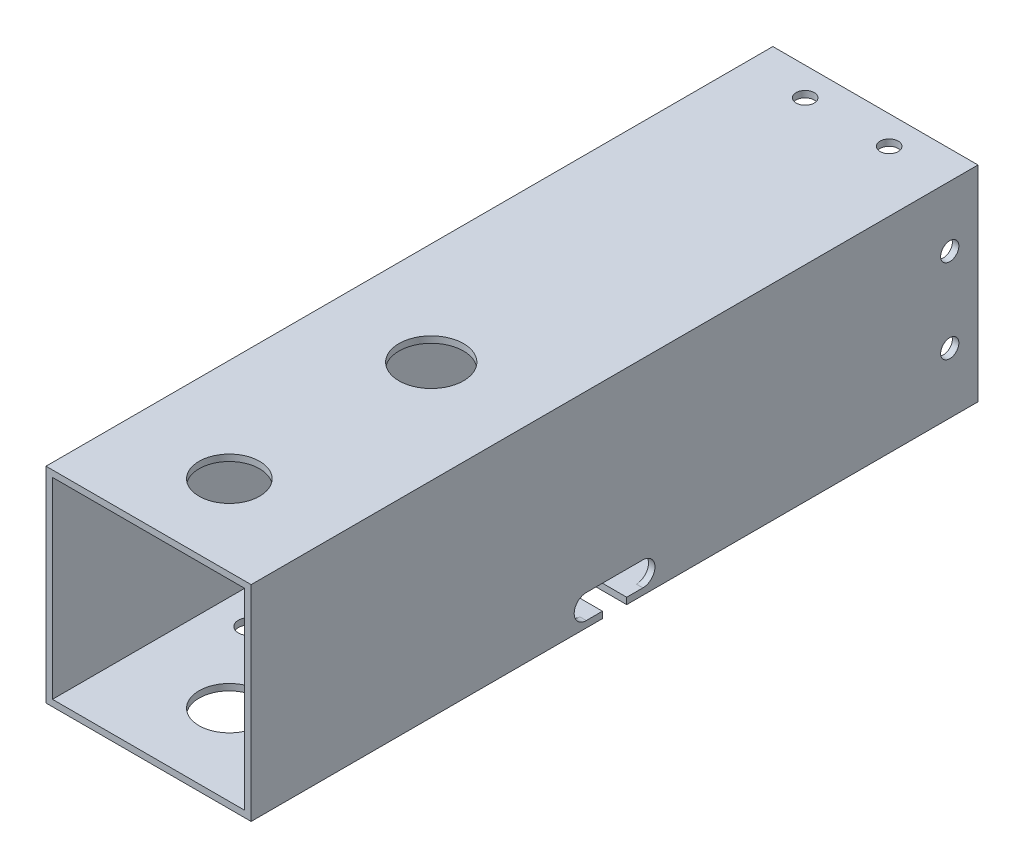
ISO-10303-21;
HEADER;
FILE_DESCRIPTION(('STEP AP214'),'2;1');
FILE_NAME('part.step','',(''),(''),'','','');
FILE_SCHEMA(('AUTOMOTIVE_DESIGN { 1 0 10303 214 1 1 1 1 }'));
ENDSEC;
DATA;
#1=APPLICATION_CONTEXT('core data for automotive mechanical design processes');
#2=APPLICATION_PROTOCOL_DEFINITION('international standard','automotive_design',2000,#1);
#3=PRODUCT_CONTEXT('',#1,'mechanical');
#4=PRODUCT('Part','Part','',(#3));
#5=PRODUCT_RELATED_PRODUCT_CATEGORY('part','',(#4));
#6=PRODUCT_DEFINITION_FORMATION('','',#4);
#7=PRODUCT_DEFINITION_CONTEXT('part definition',#1,'design');
#8=PRODUCT_DEFINITION('design','',#6,#7);
#9=PRODUCT_DEFINITION_SHAPE('','',#8);
#10=(LENGTH_UNIT() NAMED_UNIT(*) SI_UNIT(.MILLI.,.METRE.));
#11=(NAMED_UNIT(*) PLANE_ANGLE_UNIT() SI_UNIT($,.RADIAN.));
#12=(NAMED_UNIT(*) SI_UNIT($,.STERADIAN.) SOLID_ANGLE_UNIT());
#13=UNCERTAINTY_MEASURE_WITH_UNIT(LENGTH_MEASURE(1.E-05),#10,'distance_accuracy_value','');
#14=(GEOMETRIC_REPRESENTATION_CONTEXT(3) GLOBAL_UNCERTAINTY_ASSIGNED_CONTEXT((#13)) GLOBAL_UNIT_ASSIGNED_CONTEXT((#10,
#11,#12)) REPRESENTATION_CONTEXT('',''));
#15=CARTESIAN_POINT('',(0.,0.,0.));
#16=DIRECTION('',(0.,0.,1.));
#17=DIRECTION('',(1.,0.,0.));
#18=AXIS2_PLACEMENT_3D('',#15,#16,#17);
#19=CARTESIAN_POINT('',(25.4,-25.4,180.));
#20=DIRECTION('',(-1.,0.,0.));
#21=DIRECTION('',(0.,0.,1.));
#22=AXIS2_PLACEMENT_3D('',#19,#20,#21);
#23=PLANE('',#22);
#24=CARTESIAN_POINT('',(25.4,-10.4,7.));
#25=DIRECTION('',(1.,0.,0.));
#26=DIRECTION('',(0.,0.,-1.));
#27=AXIS2_PLACEMENT_3D('',#24,#25,#26);
#28=CIRCLE('',#27,2.25);
#29=CARTESIAN_POINT('',(25.4,-10.4,4.75));
#30=VERTEX_POINT('',#29);
#31=EDGE_CURVE('E241',#30,#30,#28,.T.);
#32=ORIENTED_EDGE('',*,*,#31,.F.);
#33=EDGE_LOOP('',(#32));
#34=FACE_BOUND('',#33,.T.);
#35=CARTESIAN_POINT('',(25.4,-20.8,83.));
#36=DIRECTION('',(1.,0.,0.));
#37=DIRECTION('',(0.,0.,-1.));
#38=AXIS2_PLACEMENT_3D('',#35,#36,#37);
#39=CIRCLE('',#38,3.);
#40=CARTESIAN_POINT('',(25.4,-23.8,83.));
#41=VERTEX_POINT('',#40);
#42=CARTESIAN_POINT('',(25.4,-17.8,83.));
#43=VERTEX_POINT('',#42);
#44=EDGE_CURVE('E428',#41,#43,#39,.T.);
#45=ORIENTED_EDGE('',*,*,#44,.F.);
#46=DIRECTION('',(0.,0.,-1.));
#47=VECTOR('',#46,1.);
#48=CARTESIAN_POINT('',(25.4,-23.8,97.));
#49=LINE('',#48,#47);
#50=CARTESIAN_POINT('',(25.4,-23.8,87.));
#51=VERTEX_POINT('',#50);
#52=EDGE_CURVE('E169',#51,#41,#49,.T.);
#53=ORIENTED_EDGE('',*,*,#52,.F.);
#54=DIRECTION('',(0.,-1.,0.));
#55=VECTOR('',#54,1.);
#56=CARTESIAN_POINT('',(25.4,-4.44644735455528,87.));
#57=LINE('',#56,#55);
#58=CARTESIAN_POINT('',(25.4,-25.4,87.));
#59=VERTEX_POINT('',#58);
#60=EDGE_CURVE('E367',#51,#59,#57,.T.);
#61=ORIENTED_EDGE('',*,*,#60,.T.);
#62=DIRECTION('',(0.,0.,-1.));
#63=VECTOR('',#62,1.);
#64=CARTESIAN_POINT('',(25.4,-25.4,180.));
#65=LINE('',#64,#63);
#66=CARTESIAN_POINT('',(25.4,-25.4,0.));
#67=VERTEX_POINT('',#66);
#68=EDGE_CURVE('E198',#59,#67,#65,.T.);
#69=ORIENTED_EDGE('',*,*,#68,.T.);
#70=DIRECTION('',(0.,1.,0.));
#71=VECTOR('',#70,1.);
#72=CARTESIAN_POINT('',(25.4,-25.4,0.));
#73=LINE('',#72,#71);
#74=CARTESIAN_POINT('',(25.4,25.4,0.));
#75=VERTEX_POINT('',#74);
#76=EDGE_CURVE('E187',#67,#75,#73,.T.);
#77=ORIENTED_EDGE('',*,*,#76,.T.);
#78=DIRECTION('',(0.,0.,-1.));
#79=VECTOR('',#78,1.);
#80=CARTESIAN_POINT('',(25.4,25.4,180.));
#81=LINE('',#80,#79);
#82=CARTESIAN_POINT('',(25.4,25.4,180.));
#83=VERTEX_POINT('',#82);
#84=EDGE_CURVE('E11',#83,#75,#81,.T.);
#85=ORIENTED_EDGE('',*,*,#84,.F.);
#86=DIRECTION('',(0.,1.,0.));
#87=VECTOR('',#86,1.);
#88=CARTESIAN_POINT('',(25.4,-25.4,180.));
#89=LINE('',#88,#87);
#90=CARTESIAN_POINT('',(25.4,-25.4,180.));
#91=VERTEX_POINT('',#90);
#92=EDGE_CURVE('E188',#91,#83,#89,.T.);
#93=ORIENTED_EDGE('',*,*,#92,.F.);
#94=CARTESIAN_POINT('',(25.4,-25.4,93.));
#95=VERTEX_POINT('',#94);
#96=EDGE_CURVE('E207',#91,#95,#65,.T.);
#97=ORIENTED_EDGE('',*,*,#96,.T.);
#98=DIRECTION('',(0.,-1.,0.));
#99=VECTOR('',#98,1.);
#100=CARTESIAN_POINT('',(25.4,-4.44644735455528,93.));
#101=LINE('',#100,#99);
#102=CARTESIAN_POINT('',(25.4,-23.8,93.));
#103=VERTEX_POINT('',#102);
#104=EDGE_CURVE('E375',#103,#95,#101,.T.);
#105=ORIENTED_EDGE('',*,*,#104,.F.);
#106=CARTESIAN_POINT('',(25.4,-23.8,97.));
#107=VERTEX_POINT('',#106);
#108=EDGE_CURVE('E485',#107,#103,#49,.T.);
#109=ORIENTED_EDGE('',*,*,#108,.F.);
#110=CARTESIAN_POINT('',(25.4,-20.8,97.));
#111=DIRECTION('',(1.,0.,0.));
#112=DIRECTION('',(0.,0.,-1.));
#113=AXIS2_PLACEMENT_3D('',#110,#111,#112);
#114=CIRCLE('',#113,3.);
#115=CARTESIAN_POINT('',(25.4,-17.8,97.));
#116=VERTEX_POINT('',#115);
#117=EDGE_CURVE('E356',#116,#107,#114,.T.);
#118=ORIENTED_EDGE('',*,*,#117,.F.);
#119=DIRECTION('',(0.,0.,1.));
#120=VECTOR('',#119,1.);
#121=CARTESIAN_POINT('',(25.4,-17.8,97.));
#122=LINE('',#121,#120);
#123=EDGE_CURVE('E170',#43,#116,#122,.T.);
#124=ORIENTED_EDGE('',*,*,#123,.F.);
#125=EDGE_LOOP('',(#45,#53,#61,#69,#77,#85,#93,#97,#105,#109,#118,#124));
#126=FACE_BOUND('',#125,.T.);
#127=CARTESIAN_POINT('',(25.4,10.4,7.));
#128=DIRECTION('',(1.,0.,0.));
#129=DIRECTION('',(0.,0.,-1.));
#130=AXIS2_PLACEMENT_3D('',#127,#128,#129);
#131=CIRCLE('',#130,2.25);
#132=CARTESIAN_POINT('',(25.4,10.4,4.75));
#133=VERTEX_POINT('',#132);
#134=EDGE_CURVE('E242',#133,#133,#131,.T.);
#135=ORIENTED_EDGE('',*,*,#134,.F.);
#136=EDGE_LOOP('',(#135));
#137=FACE_BOUND('',#136,.T.);
#138=ADVANCED_FACE('F36',(#34,#126,#137),#23,.F.);
#139=CARTESIAN_POINT('',(-25.4,-25.4,180.));
#140=DIRECTION('',(0.,1.,0.));
#141=DIRECTION('',(0.,0.,1.));
#142=AXIS2_PLACEMENT_3D('',#139,#140,#141);
#143=PLANE('',#142);
#144=ORIENTED_EDGE('',*,*,#68,.F.);
#145=DIRECTION('',(1.,0.,0.));
#146=VECTOR('',#145,1.);
#147=CARTESIAN_POINT('',(13.,-25.4,87.));
#148=LINE('',#147,#146);
#149=CARTESIAN_POINT('',(13.,-25.4,87.));
#150=VERTEX_POINT('',#149);
#151=EDGE_CURVE('E362',#150,#59,#148,.T.);
#152=ORIENTED_EDGE('',*,*,#151,.F.);
#153=CARTESIAN_POINT('',(13.,-25.4,90.));
#154=DIRECTION('',(0.,-1.,0.));
#155=DIRECTION('',(0.,0.,-1.));
#156=AXIS2_PLACEMENT_3D('',#153,#154,#155);
#157=CIRCLE('',#156,3.);
#158=CARTESIAN_POINT('',(13.,-25.4,93.));
#159=VERTEX_POINT('',#158);
#160=EDGE_CURVE('E351',#159,#150,#157,.T.);
#161=ORIENTED_EDGE('',*,*,#160,.F.);
#162=DIRECTION('',(-1.,0.,0.));
#163=VECTOR('',#162,1.);
#164=CARTESIAN_POINT('',(13.,-25.4,93.));
#165=LINE('',#164,#163);
#166=EDGE_CURVE('E52',#95,#159,#165,.T.);
#167=ORIENTED_EDGE('',*,*,#166,.F.);
#168=ORIENTED_EDGE('',*,*,#96,.F.);
#169=DIRECTION('',(1.,0.,0.));
#170=VECTOR('',#169,1.);
#171=CARTESIAN_POINT('',(-25.4,-25.4,180.));
#172=LINE('',#171,#170);
#173=CARTESIAN_POINT('',(-25.4,-25.4,180.));
#174=VERTEX_POINT('',#173);
#175=EDGE_CURVE('E196',#174,#91,#172,.T.);
#176=ORIENTED_EDGE('',*,*,#175,.F.);
#177=DIRECTION('',(0.,0.,-1.));
#178=VECTOR('',#177,1.);
#179=CARTESIAN_POINT('',(-25.4,-25.4,180.));
#180=LINE('',#179,#178);
#181=CARTESIAN_POINT('',(-25.4,-25.4,0.));
#182=VERTEX_POINT('',#181);
#183=EDGE_CURVE('E210',#174,#182,#180,.T.);
#184=ORIENTED_EDGE('',*,*,#183,.T.);
#185=DIRECTION('',(1.,0.,0.));
#186=VECTOR('',#185,1.);
#187=CARTESIAN_POINT('',(-25.4,-25.4,0.));
#188=LINE('',#187,#186);
#189=EDGE_CURVE('E192',#182,#67,#188,.T.);
#190=ORIENTED_EDGE('',*,*,#189,.T.);
#191=EDGE_LOOP('',(#144,#152,#161,#167,#168,#176,#184,#190));
#192=FACE_BOUND('',#191,.T.);
#193=CARTESIAN_POINT('',(15.,-25.4,140.));
#194=DIRECTION('',(0.,-1.,0.));
#195=DIRECTION('',(0.,0.,-1.));
#196=AXIS2_PLACEMENT_3D('',#193,#194,#195);
#197=CIRCLE('',#196,2.74999999999999);
#198=CARTESIAN_POINT('',(15.,-25.4,137.25));
#199=VERTEX_POINT('',#198);
#200=EDGE_CURVE('E261',#199,#199,#197,.T.);
#201=ORIENTED_EDGE('',*,*,#200,.F.);
#202=EDGE_LOOP('',(#201));
#203=FACE_BOUND('',#202,.T.);
#204=CARTESIAN_POINT('',(-15.,-25.4,140.));
#205=DIRECTION('',(0.,-1.,0.));
#206=DIRECTION('',(0.,0.,-1.));
#207=AXIS2_PLACEMENT_3D('',#204,#205,#206);
#208=CIRCLE('',#207,2.74999999999999);
#209=CARTESIAN_POINT('',(-15.,-25.4,137.25));
#210=VERTEX_POINT('',#209);
#211=EDGE_CURVE('E250',#210,#210,#208,.T.);
#212=ORIENTED_EDGE('',*,*,#211,.F.);
#213=EDGE_LOOP('',(#212));
#214=FACE_BOUND('',#213,.T.);
#215=CARTESIAN_POINT('',(-15.,-25.4,45.7));
#216=DIRECTION('',(0.,-1.,0.));
#217=DIRECTION('',(0.,0.,-1.));
#218=AXIS2_PLACEMENT_3D('',#215,#216,#217);
#219=CIRCLE('',#218,2.74999999999999);
#220=CARTESIAN_POINT('',(-15.,-25.4,42.95));
#221=VERTEX_POINT('',#220);
#222=EDGE_CURVE('E249',#221,#221,#219,.T.);
#223=ORIENTED_EDGE('',*,*,#222,.F.);
#224=EDGE_LOOP('',(#223));
#225=FACE_BOUND('',#224,.T.);
#226=CARTESIAN_POINT('',(15.,-25.4,45.7));
#227=DIRECTION('',(0.,-1.,0.));
#228=DIRECTION('',(0.,0.,-1.));
#229=AXIS2_PLACEMENT_3D('',#226,#227,#228);
#230=CIRCLE('',#229,2.74999999999999);
#231=CARTESIAN_POINT('',(15.,-25.4,42.95));
#232=VERTEX_POINT('',#231);
#233=EDGE_CURVE('E246',#232,#232,#230,.T.);
#234=ORIENTED_EDGE('',*,*,#233,.F.);
#235=EDGE_LOOP('',(#234));
#236=FACE_BOUND('',#235,.T.);
#237=CARTESIAN_POINT('',(-10.3999999999999,-25.4,7.));
#238=DIRECTION('',(0.,-1.,0.));
#239=DIRECTION('',(0.,0.,-1.));
#240=AXIS2_PLACEMENT_3D('',#237,#238,#239);
#241=CIRCLE('',#240,2.25);
#242=CARTESIAN_POINT('',(-10.3999999999999,-25.4,4.75));
#243=VERTEX_POINT('',#242);
#244=EDGE_CURVE('E233',#243,#243,#241,.T.);
#245=ORIENTED_EDGE('',*,*,#244,.F.);
#246=EDGE_LOOP('',(#245));
#247=FACE_BOUND('',#246,.T.);
#248=CARTESIAN_POINT('',(0.,-25.4,160.));
#249=DIRECTION('',(0.,1.,0.));
#250=DIRECTION('',(0.,0.,1.));
#251=AXIS2_PLACEMENT_3D('',#248,#249,#250);
#252=CIRCLE('',#251,7.50000000000001);
#253=CARTESIAN_POINT('',(0.,-25.4,167.5));
#254=VERTEX_POINT('',#253);
#255=EDGE_CURVE('E219',#254,#254,#252,.T.);
#256=ORIENTED_EDGE('',*,*,#255,.T.);
#257=EDGE_LOOP('',(#256));
#258=FACE_BOUND('',#257,.T.);
#259=CARTESIAN_POINT('',(0.,-25.4,110.));
#260=DIRECTION('',(0.,1.,0.));
#261=DIRECTION('',(0.,0.,1.));
#262=AXIS2_PLACEMENT_3D('',#259,#260,#261);
#263=CIRCLE('',#262,8.00000000000001);
#264=CARTESIAN_POINT('',(0.,-25.4,118.));
#265=VERTEX_POINT('',#264);
#266=EDGE_CURVE('E303',#265,#265,#263,.T.);
#267=ORIENTED_EDGE('',*,*,#266,.T.);
#268=EDGE_LOOP('',(#267));
#269=FACE_BOUND('',#268,.T.);
#270=CARTESIAN_POINT('',(10.4000000000001,-25.4,7.));
#271=DIRECTION('',(0.,-1.,0.));
#272=DIRECTION('',(0.,0.,-1.));
#273=AXIS2_PLACEMENT_3D('',#270,#271,#272);
#274=CIRCLE('',#273,2.25);
#275=CARTESIAN_POINT('',(10.4000000000001,-25.4,4.75));
#276=VERTEX_POINT('',#275);
#277=EDGE_CURVE('E237',#276,#276,#274,.T.);
#278=ORIENTED_EDGE('',*,*,#277,.F.);
#279=EDGE_LOOP('',(#278));
#280=FACE_BOUND('',#279,.T.);
#281=ADVANCED_FACE('F386',(#192,#203,#214,#225,#236,#247,#258,#269,#280),#143,.F.);
#282=CARTESIAN_POINT('',(0.,0.,180.));
#283=DIRECTION('',(0.,0.,-1.));
#284=DIRECTION('',(-1.,0.,0.));
#285=AXIS2_PLACEMENT_3D('',#282,#283,#284);
#286=PLANE('',#285);
#287=ORIENTED_EDGE('',*,*,#92,.T.);
#288=DIRECTION('',(-1.,0.,0.));
#289=VECTOR('',#288,1.);
#290=CARTESIAN_POINT('',(-25.4,25.4,180.));
#291=LINE('',#290,#289);
#292=CARTESIAN_POINT('',(-25.4,25.4,180.));
#293=VERTEX_POINT('',#292);
#294=EDGE_CURVE('E191',#83,#293,#291,.T.);
#295=ORIENTED_EDGE('',*,*,#294,.T.);
#296=DIRECTION('',(0.,-1.,0.));
#297=VECTOR('',#296,1.);
#298=CARTESIAN_POINT('',(-25.4,-25.4,180.));
#299=LINE('',#298,#297);
#300=EDGE_CURVE('E194',#293,#174,#299,.T.);
#301=ORIENTED_EDGE('',*,*,#300,.T.);
#302=ORIENTED_EDGE('',*,*,#175,.T.);
#303=EDGE_LOOP('',(#287,#295,#301,#302));
#304=FACE_BOUND('',#303,.T.);
#305=DIRECTION('',(0.,-1.,0.));
#306=VECTOR('',#305,1.);
#307=CARTESIAN_POINT('',(-23.8,-23.8,180.));
#308=LINE('',#307,#306);
#309=CARTESIAN_POINT('',(-23.8,23.8,180.));
#310=VERTEX_POINT('',#309);
#311=CARTESIAN_POINT('',(-23.8,-23.8,180.));
#312=VERTEX_POINT('',#311);
#313=EDGE_CURVE('E313',#310,#312,#308,.T.);
#314=ORIENTED_EDGE('',*,*,#313,.F.);
#315=DIRECTION('',(-1.,0.,0.));
#316=VECTOR('',#315,1.);
#317=CARTESIAN_POINT('',(-23.8,23.8,180.));
#318=LINE('',#317,#316);
#319=CARTESIAN_POINT('',(23.8,23.8,180.));
#320=VERTEX_POINT('',#319);
#321=EDGE_CURVE('E320',#320,#310,#318,.T.);
#322=ORIENTED_EDGE('',*,*,#321,.F.);
#323=DIRECTION('',(0.,1.,0.));
#324=VECTOR('',#323,1.);
#325=CARTESIAN_POINT('',(23.8,-23.8,180.));
#326=LINE('',#325,#324);
#327=CARTESIAN_POINT('',(23.8,-23.8,180.));
#328=VERTEX_POINT('',#327);
#329=EDGE_CURVE('E318',#328,#320,#326,.T.);
#330=ORIENTED_EDGE('',*,*,#329,.F.);
#331=DIRECTION('',(1.,0.,0.));
#332=VECTOR('',#331,1.);
#333=CARTESIAN_POINT('',(-23.8,-23.8,180.));
#334=LINE('',#333,#332);
#335=EDGE_CURVE('E315',#312,#328,#334,.T.);
#336=ORIENTED_EDGE('',*,*,#335,.F.);
#337=EDGE_LOOP('',(#314,#322,#330,#336));
#338=FACE_BOUND('',#337,.T.);
#339=ADVANCED_FACE('F340',(#304,#338),#286,.F.);
#340=CARTESIAN_POINT('',(0.,0.,0.));
#341=DIRECTION('',(0.,0.,-1.));
#342=DIRECTION('',(-1.,0.,0.));
#343=AXIS2_PLACEMENT_3D('',#340,#341,#342);
#344=PLANE('',#343);
#345=ORIENTED_EDGE('',*,*,#76,.F.);
#346=ORIENTED_EDGE('',*,*,#189,.F.);
#347=DIRECTION('',(0.,-1.,0.));
#348=VECTOR('',#347,1.);
#349=CARTESIAN_POINT('',(-25.4,-25.4,0.));
#350=LINE('',#349,#348);
#351=CARTESIAN_POINT('',(-25.4,25.4,0.));
#352=VERTEX_POINT('',#351);
#353=EDGE_CURVE('E203',#352,#182,#350,.T.);
#354=ORIENTED_EDGE('',*,*,#353,.F.);
#355=DIRECTION('',(-1.,0.,0.));
#356=VECTOR('',#355,1.);
#357=CARTESIAN_POINT('',(-25.4,25.4,0.));
#358=LINE('',#357,#356);
#359=EDGE_CURVE('E201',#75,#352,#358,.T.);
#360=ORIENTED_EDGE('',*,*,#359,.F.);
#361=EDGE_LOOP('',(#345,#346,#354,#360));
#362=FACE_BOUND('',#361,.T.);
#363=DIRECTION('',(-1.,0.,0.));
#364=VECTOR('',#363,1.);
#365=CARTESIAN_POINT('',(-23.8,23.8,0.));
#366=LINE('',#365,#364);
#367=CARTESIAN_POINT('',(23.8,23.8,0.));
#368=VERTEX_POINT('',#367);
#369=CARTESIAN_POINT('',(-23.8,23.8,0.));
#370=VERTEX_POINT('',#369);
#371=EDGE_CURVE('E316',#368,#370,#366,.T.);
#372=ORIENTED_EDGE('',*,*,#371,.T.);
#373=DIRECTION('',(0.,-1.,0.));
#374=VECTOR('',#373,1.);
#375=CARTESIAN_POINT('',(-23.8,-23.8,0.));
#376=LINE('',#375,#374);
#377=CARTESIAN_POINT('',(-23.8,-23.8,0.));
#378=VERTEX_POINT('',#377);
#379=EDGE_CURVE('E312',#370,#378,#376,.T.);
#380=ORIENTED_EDGE('',*,*,#379,.T.);
#381=DIRECTION('',(1.,0.,0.));
#382=VECTOR('',#381,1.);
#383=CARTESIAN_POINT('',(-23.8,-23.8,0.));
#384=LINE('',#383,#382);
#385=CARTESIAN_POINT('',(23.8,-23.8,0.));
#386=VERTEX_POINT('',#385);
#387=EDGE_CURVE('E324',#378,#386,#384,.T.);
#388=ORIENTED_EDGE('',*,*,#387,.T.);
#389=DIRECTION('',(0.,1.,0.));
#390=VECTOR('',#389,1.);
#391=CARTESIAN_POINT('',(23.8,-23.8,0.));
#392=LINE('',#391,#390);
#393=EDGE_CURVE('E175',#386,#368,#392,.T.);
#394=ORIENTED_EDGE('',*,*,#393,.T.);
#395=EDGE_LOOP('',(#372,#380,#388,#394));
#396=FACE_BOUND('',#395,.T.);
#397=ADVANCED_FACE('F335',(#362,#396),#344,.T.);
#398=CARTESIAN_POINT('',(-25.4,25.4,180.));
#399=DIRECTION('',(0.,-1.,0.));
#400=DIRECTION('',(0.,0.,-1.));
#401=AXIS2_PLACEMENT_3D('',#398,#399,#400);
#402=PLANE('',#401);
#403=CARTESIAN_POINT('',(-10.4000000000003,25.3999999999999,7.));
#404=DIRECTION('',(0.,1.,0.));
#405=DIRECTION('',(0.,0.,1.));
#406=AXIS2_PLACEMENT_3D('',#403,#404,#405);
#407=CIRCLE('',#406,2.25);
#408=CARTESIAN_POINT('',(-10.4000000000003,25.3999999999999,9.25));
#409=VERTEX_POINT('',#408);
#410=EDGE_CURVE('E245',#409,#409,#407,.T.);
#411=ORIENTED_EDGE('',*,*,#410,.F.);
#412=EDGE_LOOP('',(#411));
#413=FACE_BOUND('',#412,.T.);
#414=CARTESIAN_POINT('',(10.3999999999997,25.4000000000001,7.));
#415=DIRECTION('',(0.,1.,0.));
#416=DIRECTION('',(0.,0.,1.));
#417=AXIS2_PLACEMENT_3D('',#414,#415,#416);
#418=CIRCLE('',#417,2.25);
#419=CARTESIAN_POINT('',(10.3999999999997,25.4000000000001,9.25));
#420=VERTEX_POINT('',#419);
#421=EDGE_CURVE('E274',#420,#420,#418,.T.);
#422=ORIENTED_EDGE('',*,*,#421,.F.);
#423=EDGE_LOOP('',(#422));
#424=FACE_BOUND('',#423,.T.);
#425=CARTESIAN_POINT('',(0.,25.4,160.));
#426=DIRECTION('',(0.,1.,0.));
#427=DIRECTION('',(0.,0.,1.));
#428=AXIS2_PLACEMENT_3D('',#425,#426,#427);
#429=CIRCLE('',#428,7.50000000000001);
#430=CARTESIAN_POINT('',(0.,25.4,167.5));
#431=VERTEX_POINT('',#430);
#432=EDGE_CURVE('E300',#431,#431,#429,.T.);
#433=ORIENTED_EDGE('',*,*,#432,.F.);
#434=EDGE_LOOP('',(#433));
#435=FACE_BOUND('',#434,.T.);
#436=CARTESIAN_POINT('',(0.,25.4,110.));
#437=DIRECTION('',(0.,1.,0.));
#438=DIRECTION('',(0.,0.,1.));
#439=AXIS2_PLACEMENT_3D('',#436,#437,#438);
#440=CIRCLE('',#439,8.00000000000001);
#441=CARTESIAN_POINT('',(0.,25.4,118.));
#442=VERTEX_POINT('',#441);
#443=EDGE_CURVE('E227',#442,#442,#440,.T.);
#444=ORIENTED_EDGE('',*,*,#443,.F.);
#445=EDGE_LOOP('',(#444));
#446=FACE_BOUND('',#445,.T.);
#447=ORIENTED_EDGE('',*,*,#359,.T.);
#448=DIRECTION('',(0.,0.,-1.));
#449=VECTOR('',#448,1.);
#450=CARTESIAN_POINT('',(-25.4,25.4,180.));
#451=LINE('',#450,#449);
#452=EDGE_CURVE('E44',#293,#352,#451,.T.);
#453=ORIENTED_EDGE('',*,*,#452,.F.);
#454=ORIENTED_EDGE('',*,*,#294,.F.);
#455=ORIENTED_EDGE('',*,*,#84,.T.);
#456=EDGE_LOOP('',(#447,#453,#454,#455));
#457=FACE_BOUND('',#456,.T.);
#458=ADVANCED_FACE('F503',(#413,#424,#435,#446,#457),#402,.F.);
#459=CARTESIAN_POINT('',(-25.4,-25.4,180.));
#460=DIRECTION('',(1.,0.,0.));
#461=DIRECTION('',(0.,0.,-1.));
#462=AXIS2_PLACEMENT_3D('',#459,#460,#461);
#463=PLANE('',#462);
#464=CARTESIAN_POINT('',(-25.4,-10.4,7.));
#465=DIRECTION('',(-1.,0.,0.));
#466=DIRECTION('',(0.,0.,1.));
#467=AXIS2_PLACEMENT_3D('',#464,#465,#466);
#468=CIRCLE('',#467,2.25);
#469=CARTESIAN_POINT('',(-25.4,-10.4,9.25));
#470=VERTEX_POINT('',#469);
#471=EDGE_CURVE('E232',#470,#470,#468,.T.);
#472=ORIENTED_EDGE('',*,*,#471,.F.);
#473=EDGE_LOOP('',(#472));
#474=FACE_BOUND('',#473,.T.);
#475=CARTESIAN_POINT('',(-25.4,10.4,7.));
#476=DIRECTION('',(-1.,0.,0.));
#477=DIRECTION('',(0.,0.,1.));
#478=AXIS2_PLACEMENT_3D('',#475,#476,#477);
#479=CIRCLE('',#478,2.25);
#480=CARTESIAN_POINT('',(-25.4,10.4,9.25));
#481=VERTEX_POINT('',#480);
#482=EDGE_CURVE('E228',#481,#481,#479,.T.);
#483=ORIENTED_EDGE('',*,*,#482,.F.);
#484=EDGE_LOOP('',(#483));
#485=FACE_BOUND('',#484,.T.);
#486=ORIENTED_EDGE('',*,*,#353,.T.);
#487=ORIENTED_EDGE('',*,*,#183,.F.);
#488=ORIENTED_EDGE('',*,*,#300,.F.);
#489=ORIENTED_EDGE('',*,*,#452,.T.);
#490=EDGE_LOOP('',(#486,#487,#488,#489));
#491=FACE_BOUND('',#490,.T.);
#492=ADVANCED_FACE('F508',(#474,#485,#491),#463,.F.);
#493=CARTESIAN_POINT('',(-23.8,-23.8,180.));
#494=DIRECTION('',(1.,0.,0.));
#495=DIRECTION('',(0.,0.,-1.));
#496=AXIS2_PLACEMENT_3D('',#493,#494,#495);
#497=PLANE('',#496);
#498=CARTESIAN_POINT('',(-23.8,-10.4,7.));
#499=DIRECTION('',(1.,0.,0.));
#500=DIRECTION('',(0.,0.,-1.));
#501=AXIS2_PLACEMENT_3D('',#498,#499,#500);
#502=CIRCLE('',#501,2.25);
#503=CARTESIAN_POINT('',(-23.8,-10.4,4.75));
#504=VERTEX_POINT('',#503);
#505=EDGE_CURVE('E293',#504,#504,#502,.T.);
#506=ORIENTED_EDGE('',*,*,#505,.F.);
#507=EDGE_LOOP('',(#506));
#508=FACE_BOUND('',#507,.T.);
#509=CARTESIAN_POINT('',(-23.8,10.4,7.));
#510=DIRECTION('',(1.,0.,0.));
#511=DIRECTION('',(0.,0.,-1.));
#512=AXIS2_PLACEMENT_3D('',#509,#510,#511);
#513=CIRCLE('',#512,2.25);
#514=CARTESIAN_POINT('',(-23.8,10.4,4.75));
#515=VERTEX_POINT('',#514);
#516=EDGE_CURVE('E224',#515,#515,#513,.T.);
#517=ORIENTED_EDGE('',*,*,#516,.F.);
#518=EDGE_LOOP('',(#517));
#519=FACE_BOUND('',#518,.T.);
#520=ORIENTED_EDGE('',*,*,#379,.F.);
#521=DIRECTION('',(0.,0.,-1.));
#522=VECTOR('',#521,1.);
#523=CARTESIAN_POINT('',(-23.8,23.8,180.));
#524=LINE('',#523,#522);
#525=EDGE_CURVE('E181',#310,#370,#524,.T.);
#526=ORIENTED_EDGE('',*,*,#525,.F.);
#527=ORIENTED_EDGE('',*,*,#313,.T.);
#528=DIRECTION('',(0.,0.,-1.));
#529=VECTOR('',#528,1.);
#530=CARTESIAN_POINT('',(-23.8,-23.8,180.));
#531=LINE('',#530,#529);
#532=EDGE_CURVE('E180',#312,#378,#531,.T.);
#533=ORIENTED_EDGE('',*,*,#532,.T.);
#534=EDGE_LOOP('',(#520,#526,#527,#533));
#535=FACE_BOUND('',#534,.T.);
#536=ADVANCED_FACE('F338',(#508,#519,#535),#497,.T.);
#537=CARTESIAN_POINT('',(-23.8,-23.8,180.));
#538=DIRECTION('',(0.,1.,0.));
#539=DIRECTION('',(0.,0.,1.));
#540=AXIS2_PLACEMENT_3D('',#537,#538,#539);
#541=PLANE('',#540);
#542=DIRECTION('',(1.,0.,0.));
#543=VECTOR('',#542,1.);
#544=CARTESIAN_POINT('',(13.,-23.8,87.));
#545=LINE('',#544,#543);
#546=CARTESIAN_POINT('',(13.,-23.8,87.));
#547=VERTEX_POINT('',#546);
#548=EDGE_CURVE('E361',#547,#51,#545,.T.);
#549=ORIENTED_EDGE('',*,*,#548,.T.);
#550=ORIENTED_EDGE('',*,*,#52,.T.);
#551=DIRECTION('',(1.,0.,0.));
#552=VECTOR('',#551,1.);
#553=CARTESIAN_POINT('',(2.91938698217888,-23.8,83.));
#554=LINE('',#553,#552);
#555=CARTESIAN_POINT('',(23.8,-23.8,83.));
#556=VERTEX_POINT('',#555);
#557=EDGE_CURVE('E156',#556,#41,#554,.T.);
#558=ORIENTED_EDGE('',*,*,#557,.F.);
#559=DIRECTION('',(0.,0.,-1.));
#560=VECTOR('',#559,1.);
#561=CARTESIAN_POINT('',(23.8,-23.8,180.));
#562=LINE('',#561,#560);
#563=EDGE_CURVE('E166',#556,#386,#562,.T.);
#564=ORIENTED_EDGE('',*,*,#563,.T.);
#565=ORIENTED_EDGE('',*,*,#387,.F.);
#566=ORIENTED_EDGE('',*,*,#532,.F.);
#567=ORIENTED_EDGE('',*,*,#335,.T.);
#568=CARTESIAN_POINT('',(23.8,-23.8,97.));
#569=VERTEX_POINT('',#568);
#570=EDGE_CURVE('E177',#328,#569,#562,.T.);
#571=ORIENTED_EDGE('',*,*,#570,.T.);
#572=DIRECTION('',(1.,0.,0.));
#573=VECTOR('',#572,1.);
#574=CARTESIAN_POINT('',(2.91938698217888,-23.8,97.));
#575=LINE('',#574,#573);
#576=EDGE_CURVE('E348',#569,#107,#575,.T.);
#577=ORIENTED_EDGE('',*,*,#576,.T.);
#578=ORIENTED_EDGE('',*,*,#108,.T.);
#579=DIRECTION('',(-1.,0.,0.));
#580=VECTOR('',#579,1.);
#581=CARTESIAN_POINT('',(13.,-23.8,93.));
#582=LINE('',#581,#580);
#583=CARTESIAN_POINT('',(13.,-23.8,93.));
#584=VERTEX_POINT('',#583);
#585=EDGE_CURVE('E373',#103,#584,#582,.T.);
#586=ORIENTED_EDGE('',*,*,#585,.T.);
#587=CARTESIAN_POINT('',(13.,-23.8,90.));
#588=DIRECTION('',(0.,1.,0.));
#589=DIRECTION('',(0.,0.,1.));
#590=AXIS2_PLACEMENT_3D('',#587,#588,#589);
#591=CIRCLE('',#590,3.);
#592=EDGE_CURVE('E368',#584,#547,#591,.F.);
#593=ORIENTED_EDGE('',*,*,#592,.T.);
#594=EDGE_LOOP('',(#549,#550,#558,#564,#565,#566,#567,#571,#577,#578,#586,#593));
#595=FACE_BOUND('',#594,.T.);
#596=CARTESIAN_POINT('',(15.,-23.8,140.));
#597=DIRECTION('',(0.,1.,0.));
#598=DIRECTION('',(0.,0.,1.));
#599=AXIS2_PLACEMENT_3D('',#596,#597,#598);
#600=CIRCLE('',#599,2.74999999999999);
#601=CARTESIAN_POINT('',(15.,-23.8,142.75));
#602=VERTEX_POINT('',#601);
#603=EDGE_CURVE('E39',#602,#602,#600,.T.);
#604=ORIENTED_EDGE('',*,*,#603,.F.);
#605=EDGE_LOOP('',(#604));
#606=FACE_BOUND('',#605,.T.);
#607=CARTESIAN_POINT('',(-15.,-23.8,140.));
#608=DIRECTION('',(0.,1.,0.));
#609=DIRECTION('',(0.,0.,1.));
#610=AXIS2_PLACEMENT_3D('',#607,#608,#609);
#611=CIRCLE('',#610,2.74999999999999);
#612=CARTESIAN_POINT('',(-15.,-23.8,142.75));
#613=VERTEX_POINT('',#612);
#614=EDGE_CURVE('E247',#613,#613,#611,.T.);
#615=ORIENTED_EDGE('',*,*,#614,.F.);
#616=EDGE_LOOP('',(#615));
#617=FACE_BOUND('',#616,.T.);
#618=CARTESIAN_POINT('',(-15.,-23.8,45.7));
#619=DIRECTION('',(0.,1.,0.));
#620=DIRECTION('',(0.,0.,1.));
#621=AXIS2_PLACEMENT_3D('',#618,#619,#620);
#622=CIRCLE('',#621,2.74999999999999);
#623=CARTESIAN_POINT('',(-15.,-23.8,48.45));
#624=VERTEX_POINT('',#623);
#625=EDGE_CURVE('E254',#624,#624,#622,.T.);
#626=ORIENTED_EDGE('',*,*,#625,.F.);
#627=EDGE_LOOP('',(#626));
#628=FACE_BOUND('',#627,.T.);
#629=CARTESIAN_POINT('',(15.,-23.8,45.7));
#630=DIRECTION('',(0.,1.,0.));
#631=DIRECTION('',(0.,0.,1.));
#632=AXIS2_PLACEMENT_3D('',#629,#630,#631);
#633=CIRCLE('',#632,2.74999999999999);
#634=CARTESIAN_POINT('',(15.,-23.8,48.45));
#635=VERTEX_POINT('',#634);
#636=EDGE_CURVE('E243',#635,#635,#633,.T.);
#637=ORIENTED_EDGE('',*,*,#636,.F.);
#638=EDGE_LOOP('',(#637));
#639=FACE_BOUND('',#638,.T.);
#640=CARTESIAN_POINT('',(10.4000000000001,-23.8,7.));
#641=DIRECTION('',(0.,1.,0.));
#642=DIRECTION('',(0.,0.,1.));
#643=AXIS2_PLACEMENT_3D('',#640,#641,#642);
#644=CIRCLE('',#643,2.25);
#645=CARTESIAN_POINT('',(10.4000000000001,-23.8,9.24999999999999));
#646=VERTEX_POINT('',#645);
#647=EDGE_CURVE('E234',#646,#646,#644,.T.);
#648=ORIENTED_EDGE('',*,*,#647,.F.);
#649=EDGE_LOOP('',(#648));
#650=FACE_BOUND('',#649,.T.);
#651=CARTESIAN_POINT('',(-10.3999999999999,-23.8,7.));
#652=DIRECTION('',(0.,1.,0.));
#653=DIRECTION('',(0.,0.,1.));
#654=AXIS2_PLACEMENT_3D('',#651,#652,#653);
#655=CIRCLE('',#654,2.25);
#656=CARTESIAN_POINT('',(-10.3999999999999,-23.8,9.25));
#657=VERTEX_POINT('',#656);
#658=EDGE_CURVE('E229',#657,#657,#655,.T.);
#659=ORIENTED_EDGE('',*,*,#658,.F.);
#660=EDGE_LOOP('',(#659));
#661=FACE_BOUND('',#660,.T.);
#662=CARTESIAN_POINT('',(0.,-23.8,160.));
#663=DIRECTION('',(0.,1.,0.));
#664=DIRECTION('',(0.,0.,1.));
#665=AXIS2_PLACEMENT_3D('',#662,#663,#664);
#666=CIRCLE('',#665,7.50000000000001);
#667=CARTESIAN_POINT('',(0.,-23.8,167.5));
#668=VERTEX_POINT('',#667);
#669=EDGE_CURVE('E223',#668,#668,#666,.T.);
#670=ORIENTED_EDGE('',*,*,#669,.F.);
#671=EDGE_LOOP('',(#670));
#672=FACE_BOUND('',#671,.T.);
#673=CARTESIAN_POINT('',(0.,-23.8,110.));
#674=DIRECTION('',(0.,1.,0.));
#675=DIRECTION('',(0.,0.,1.));
#676=AXIS2_PLACEMENT_3D('',#673,#674,#675);
#677=CIRCLE('',#676,8.00000000000001);
#678=CARTESIAN_POINT('',(0.,-23.8,118.));
#679=VERTEX_POINT('',#678);
#680=EDGE_CURVE('E218',#679,#679,#677,.T.);
#681=ORIENTED_EDGE('',*,*,#680,.F.);
#682=EDGE_LOOP('',(#681));
#683=FACE_BOUND('',#682,.T.);
#684=ADVANCED_FACE('F164',(#595,#606,#617,#628,#639,#650,#661,#672,#683),#541,.T.);
#685=CARTESIAN_POINT('',(23.8,-23.8,180.));
#686=DIRECTION('',(-1.,0.,0.));
#687=DIRECTION('',(0.,-1.,0.));
#688=AXIS2_PLACEMENT_3D('',#685,#686,#687);
#689=PLANE('',#688);
#690=CARTESIAN_POINT('',(23.8,-20.8,83.));
#691=DIRECTION('',(-1.,0.,0.));
#692=DIRECTION('',(0.,-1.,0.));
#693=AXIS2_PLACEMENT_3D('',#690,#691,#692);
#694=CIRCLE('',#693,3.);
#695=CARTESIAN_POINT('',(23.8,-17.8,83.));
#696=VERTEX_POINT('',#695);
#697=EDGE_CURVE('E152',#556,#696,#694,.F.);
#698=ORIENTED_EDGE('',*,*,#697,.T.);
#699=DIRECTION('',(0.,0.,1.));
#700=VECTOR('',#699,1.);
#701=CARTESIAN_POINT('',(23.8,-17.8,97.));
#702=LINE('',#701,#700);
#703=CARTESIAN_POINT('',(23.8,-17.8,97.));
#704=VERTEX_POINT('',#703);
#705=EDGE_CURVE('E345',#696,#704,#702,.T.);
#706=ORIENTED_EDGE('',*,*,#705,.T.);
#707=CARTESIAN_POINT('',(23.8,-20.8,97.));
#708=DIRECTION('',(-1.,0.,0.));
#709=DIRECTION('',(0.,-1.,0.));
#710=AXIS2_PLACEMENT_3D('',#707,#708,#709);
#711=CIRCLE('',#710,3.);
#712=EDGE_CURVE('E344',#704,#569,#711,.F.);
#713=ORIENTED_EDGE('',*,*,#712,.T.);
#714=ORIENTED_EDGE('',*,*,#570,.F.);
#715=ORIENTED_EDGE('',*,*,#329,.T.);
#716=DIRECTION('',(0.,0.,-1.));
#717=VECTOR('',#716,1.);
#718=CARTESIAN_POINT('',(23.8,23.8,180.));
#719=LINE('',#718,#717);
#720=EDGE_CURVE('E60',#320,#368,#719,.T.);
#721=ORIENTED_EDGE('',*,*,#720,.T.);
#722=ORIENTED_EDGE('',*,*,#393,.F.);
#723=ORIENTED_EDGE('',*,*,#563,.F.);
#724=EDGE_LOOP('',(#698,#706,#713,#714,#715,#721,#722,#723));
#725=FACE_BOUND('',#724,.T.);
#726=CARTESIAN_POINT('',(23.8,10.4,7.));
#727=DIRECTION('',(-1.,0.,0.));
#728=DIRECTION('',(0.,-1.,0.));
#729=AXIS2_PLACEMENT_3D('',#726,#727,#728);
#730=CIRCLE('',#729,2.25);
#731=CARTESIAN_POINT('',(23.8,8.15,7.));
#732=VERTEX_POINT('',#731);
#733=EDGE_CURVE('E238',#732,#732,#730,.T.);
#734=ORIENTED_EDGE('',*,*,#733,.F.);
#735=EDGE_LOOP('',(#734));
#736=FACE_BOUND('',#735,.T.);
#737=CARTESIAN_POINT('',(23.8,-10.4,7.));
#738=DIRECTION('',(-1.,0.,0.));
#739=DIRECTION('',(0.,-1.,0.));
#740=AXIS2_PLACEMENT_3D('',#737,#738,#739);
#741=CIRCLE('',#740,2.25);
#742=CARTESIAN_POINT('',(23.8,-12.65,7.));
#743=VERTEX_POINT('',#742);
#744=EDGE_CURVE('E284',#743,#743,#741,.T.);
#745=ORIENTED_EDGE('',*,*,#744,.F.);
#746=EDGE_LOOP('',(#745));
#747=FACE_BOUND('',#746,.T.);
#748=ADVANCED_FACE('F172',(#725,#736,#747),#689,.T.);
#749=CARTESIAN_POINT('',(-23.8,23.8,180.));
#750=DIRECTION('',(0.,-1.,0.));
#751=DIRECTION('',(1.,0.,0.));
#752=AXIS2_PLACEMENT_3D('',#749,#750,#751);
#753=PLANE('',#752);
#754=CARTESIAN_POINT('',(-10.4000000000003,23.8,7.));
#755=DIRECTION('',(0.,-1.,0.));
#756=DIRECTION('',(1.,0.,0.));
#757=AXIS2_PLACEMENT_3D('',#754,#755,#756);
#758=CIRCLE('',#757,2.25);
#759=CARTESIAN_POINT('',(-8.15000000000027,23.8,7.));
#760=VERTEX_POINT('',#759);
#761=EDGE_CURVE('E271',#760,#760,#758,.T.);
#762=ORIENTED_EDGE('',*,*,#761,.F.);
#763=EDGE_LOOP('',(#762));
#764=FACE_BOUND('',#763,.T.);
#765=CARTESIAN_POINT('',(10.3999999999997,23.8,7.));
#766=DIRECTION('',(0.,-1.,0.));
#767=DIRECTION('',(1.,0.,0.));
#768=AXIS2_PLACEMENT_3D('',#765,#766,#767);
#769=CIRCLE('',#768,2.25);
#770=CARTESIAN_POINT('',(12.6499999999997,23.8,7.));
#771=VERTEX_POINT('',#770);
#772=EDGE_CURVE('E277',#771,#771,#769,.T.);
#773=ORIENTED_EDGE('',*,*,#772,.F.);
#774=EDGE_LOOP('',(#773));
#775=FACE_BOUND('',#774,.T.);
#776=CARTESIAN_POINT('',(0.,23.8,160.));
#777=DIRECTION('',(0.,-1.,0.));
#778=DIRECTION('',(1.,0.,0.));
#779=AXIS2_PLACEMENT_3D('',#776,#777,#778);
#780=CIRCLE('',#779,7.50000000000001);
#781=CARTESIAN_POINT('',(7.50000000000001,23.8,160.));
#782=VERTEX_POINT('',#781);
#783=EDGE_CURVE('E220',#782,#782,#780,.T.);
#784=ORIENTED_EDGE('',*,*,#783,.F.);
#785=EDGE_LOOP('',(#784));
#786=FACE_BOUND('',#785,.T.);
#787=CARTESIAN_POINT('',(0.,23.8,110.));
#788=DIRECTION('',(0.,-1.,0.));
#789=DIRECTION('',(1.,0.,0.));
#790=AXIS2_PLACEMENT_3D('',#787,#788,#789);
#791=CIRCLE('',#790,8.00000000000001);
#792=CARTESIAN_POINT('',(8.,23.8,110.));
#793=VERTEX_POINT('',#792);
#794=EDGE_CURVE('E215',#793,#793,#791,.T.);
#795=ORIENTED_EDGE('',*,*,#794,.F.);
#796=EDGE_LOOP('',(#795));
#797=FACE_BOUND('',#796,.T.);
#798=ORIENTED_EDGE('',*,*,#371,.F.);
#799=ORIENTED_EDGE('',*,*,#720,.F.);
#800=ORIENTED_EDGE('',*,*,#321,.T.);
#801=ORIENTED_EDGE('',*,*,#525,.T.);
#802=EDGE_LOOP('',(#798,#799,#800,#801));
#803=FACE_BOUND('',#802,.T.);
#804=ADVANCED_FACE('F330',(#764,#775,#786,#797,#803),#753,.T.);
#805=CARTESIAN_POINT('',(0.,-25.4,110.));
#806=DIRECTION('',(0.,1.,0.));
#807=DIRECTION('',(0.,0.,1.));
#808=AXIS2_PLACEMENT_3D('',#805,#806,#807);
#809=CYLINDRICAL_SURFACE('',#808,8.00000000000001);
#810=ORIENTED_EDGE('',*,*,#794,.T.);
#811=EDGE_LOOP('',(#810));
#812=FACE_BOUND('',#811,.T.);
#813=ORIENTED_EDGE('',*,*,#443,.T.);
#814=EDGE_LOOP('',(#813));
#815=FACE_BOUND('',#814,.T.);
#816=ADVANCED_FACE('F532',(#812,#815),#809,.F.);
#817=CARTESIAN_POINT('',(0.,-25.4,160.));
#818=DIRECTION('',(0.,1.,0.));
#819=DIRECTION('',(0.,0.,1.));
#820=AXIS2_PLACEMENT_3D('',#817,#818,#819);
#821=CYLINDRICAL_SURFACE('',#820,7.50000000000001);
#822=ORIENTED_EDGE('',*,*,#783,.T.);
#823=EDGE_LOOP('',(#822));
#824=FACE_BOUND('',#823,.T.);
#825=ORIENTED_EDGE('',*,*,#432,.T.);
#826=EDGE_LOOP('',(#825));
#827=FACE_BOUND('',#826,.T.);
#828=ADVANCED_FACE('F536',(#824,#827),#821,.F.);
#829=ORIENTED_EDGE('',*,*,#680,.T.);
#830=EDGE_LOOP('',(#829));
#831=FACE_BOUND('',#830,.T.);
#832=ORIENTED_EDGE('',*,*,#266,.F.);
#833=EDGE_LOOP('',(#832));
#834=FACE_BOUND('',#833,.T.);
#835=ADVANCED_FACE('F538',(#831,#834),#809,.F.);
#836=ORIENTED_EDGE('',*,*,#669,.T.);
#837=EDGE_LOOP('',(#836));
#838=FACE_BOUND('',#837,.T.);
#839=ORIENTED_EDGE('',*,*,#255,.F.);
#840=EDGE_LOOP('',(#839));
#841=FACE_BOUND('',#840,.T.);
#842=ADVANCED_FACE('F542',(#838,#841),#821,.F.);
#843=CARTESIAN_POINT('',(-25.4,10.4,7.));
#844=DIRECTION('',(-1.,0.,0.));
#845=DIRECTION('',(0.,0.,1.));
#846=AXIS2_PLACEMENT_3D('',#843,#844,#845);
#847=CYLINDRICAL_SURFACE('',#846,2.25);
#848=ORIENTED_EDGE('',*,*,#516,.T.);
#849=EDGE_LOOP('',(#848));
#850=FACE_BOUND('',#849,.T.);
#851=ORIENTED_EDGE('',*,*,#482,.T.);
#852=EDGE_LOOP('',(#851));
#853=FACE_BOUND('',#852,.T.);
#854=ADVANCED_FACE('F543',(#850,#853),#847,.F.);
#855=CARTESIAN_POINT('',(-25.4,-10.4,7.));
#856=DIRECTION('',(-1.,0.,0.));
#857=DIRECTION('',(0.,0.,1.));
#858=AXIS2_PLACEMENT_3D('',#855,#856,#857);
#859=CYLINDRICAL_SURFACE('',#858,2.25);
#860=ORIENTED_EDGE('',*,*,#505,.T.);
#861=EDGE_LOOP('',(#860));
#862=FACE_BOUND('',#861,.T.);
#863=ORIENTED_EDGE('',*,*,#471,.T.);
#864=EDGE_LOOP('',(#863));
#865=FACE_BOUND('',#864,.T.);
#866=ADVANCED_FACE('F417',(#862,#865),#859,.F.);
#867=CARTESIAN_POINT('',(-10.3999999999999,-25.4,7.));
#868=DIRECTION('',(0.,-1.,0.));
#869=DIRECTION('',(0.,0.,-1.));
#870=AXIS2_PLACEMENT_3D('',#867,#868,#869);
#871=CYLINDRICAL_SURFACE('',#870,2.25);
#872=ORIENTED_EDGE('',*,*,#658,.T.);
#873=EDGE_LOOP('',(#872));
#874=FACE_BOUND('',#873,.T.);
#875=ORIENTED_EDGE('',*,*,#244,.T.);
#876=EDGE_LOOP('',(#875));
#877=FACE_BOUND('',#876,.T.);
#878=ADVANCED_FACE('F407',(#874,#877),#871,.F.);
#879=CARTESIAN_POINT('',(10.4000000000001,-25.4,7.));
#880=DIRECTION('',(0.,-1.,0.));
#881=DIRECTION('',(0.,0.,-1.));
#882=AXIS2_PLACEMENT_3D('',#879,#880,#881);
#883=CYLINDRICAL_SURFACE('',#882,2.25);
#884=ORIENTED_EDGE('',*,*,#647,.T.);
#885=EDGE_LOOP('',(#884));
#886=FACE_BOUND('',#885,.T.);
#887=ORIENTED_EDGE('',*,*,#277,.T.);
#888=EDGE_LOOP('',(#887));
#889=FACE_BOUND('',#888,.T.);
#890=ADVANCED_FACE('F404',(#886,#889),#883,.F.);
#891=CARTESIAN_POINT('',(25.4,-10.4,7.));
#892=DIRECTION('',(1.,0.,0.));
#893=DIRECTION('',(0.,0.,-1.));
#894=AXIS2_PLACEMENT_3D('',#891,#892,#893);
#895=CYLINDRICAL_SURFACE('',#894,2.25);
#896=ORIENTED_EDGE('',*,*,#744,.T.);
#897=EDGE_LOOP('',(#896));
#898=FACE_BOUND('',#897,.T.);
#899=ORIENTED_EDGE('',*,*,#31,.T.);
#900=EDGE_LOOP('',(#899));
#901=FACE_BOUND('',#900,.T.);
#902=ADVANCED_FACE('F406',(#898,#901),#895,.F.);
#903=CARTESIAN_POINT('',(25.4,10.4,7.));
#904=DIRECTION('',(1.,0.,0.));
#905=DIRECTION('',(0.,0.,-1.));
#906=AXIS2_PLACEMENT_3D('',#903,#904,#905);
#907=CYLINDRICAL_SURFACE('',#906,2.25);
#908=ORIENTED_EDGE('',*,*,#733,.T.);
#909=EDGE_LOOP('',(#908));
#910=FACE_BOUND('',#909,.T.);
#911=ORIENTED_EDGE('',*,*,#134,.T.);
#912=EDGE_LOOP('',(#911));
#913=FACE_BOUND('',#912,.T.);
#914=ADVANCED_FACE('F414',(#910,#913),#907,.F.);
#915=CARTESIAN_POINT('',(10.3999999999997,25.4000000000001,7.));
#916=DIRECTION('',(0.,1.,0.));
#917=DIRECTION('',(0.,0.,1.));
#918=AXIS2_PLACEMENT_3D('',#915,#916,#917);
#919=CYLINDRICAL_SURFACE('',#918,2.25);
#920=ORIENTED_EDGE('',*,*,#772,.T.);
#921=EDGE_LOOP('',(#920));
#922=FACE_BOUND('',#921,.T.);
#923=ORIENTED_EDGE('',*,*,#421,.T.);
#924=EDGE_LOOP('',(#923));
#925=FACE_BOUND('',#924,.T.);
#926=ADVANCED_FACE('F432',(#922,#925),#919,.F.);
#927=CARTESIAN_POINT('',(-10.4000000000003,25.3999999999999,7.));
#928=DIRECTION('',(0.,1.,0.));
#929=DIRECTION('',(0.,0.,1.));
#930=AXIS2_PLACEMENT_3D('',#927,#928,#929);
#931=CYLINDRICAL_SURFACE('',#930,2.25);
#932=ORIENTED_EDGE('',*,*,#761,.T.);
#933=EDGE_LOOP('',(#932));
#934=FACE_BOUND('',#933,.T.);
#935=ORIENTED_EDGE('',*,*,#410,.T.);
#936=EDGE_LOOP('',(#935));
#937=FACE_BOUND('',#936,.T.);
#938=ADVANCED_FACE('F438',(#934,#937),#931,.F.);
#939=CARTESIAN_POINT('',(15.,-25.4,45.7));
#940=DIRECTION('',(0.,-1.,0.));
#941=DIRECTION('',(0.,0.,-1.));
#942=AXIS2_PLACEMENT_3D('',#939,#940,#941);
#943=CYLINDRICAL_SURFACE('',#942,2.74999999999999);
#944=ORIENTED_EDGE('',*,*,#636,.T.);
#945=EDGE_LOOP('',(#944));
#946=FACE_BOUND('',#945,.T.);
#947=ORIENTED_EDGE('',*,*,#233,.T.);
#948=EDGE_LOOP('',(#947));
#949=FACE_BOUND('',#948,.T.);
#950=ADVANCED_FACE('F444',(#946,#949),#943,.F.);
#951=CARTESIAN_POINT('',(-15.,-25.4,45.7));
#952=DIRECTION('',(0.,-1.,0.));
#953=DIRECTION('',(0.,0.,-1.));
#954=AXIS2_PLACEMENT_3D('',#951,#952,#953);
#955=CYLINDRICAL_SURFACE('',#954,2.74999999999999);
#956=ORIENTED_EDGE('',*,*,#625,.T.);
#957=EDGE_LOOP('',(#956));
#958=FACE_BOUND('',#957,.T.);
#959=ORIENTED_EDGE('',*,*,#222,.T.);
#960=EDGE_LOOP('',(#959));
#961=FACE_BOUND('',#960,.T.);
#962=ADVANCED_FACE('F448',(#958,#961),#955,.F.);
#963=CARTESIAN_POINT('',(-15.,-25.4,140.));
#964=DIRECTION('',(0.,-1.,0.));
#965=DIRECTION('',(0.,0.,-1.));
#966=AXIS2_PLACEMENT_3D('',#963,#964,#965);
#967=CYLINDRICAL_SURFACE('',#966,2.74999999999999);
#968=ORIENTED_EDGE('',*,*,#614,.T.);
#969=EDGE_LOOP('',(#968));
#970=FACE_BOUND('',#969,.T.);
#971=ORIENTED_EDGE('',*,*,#211,.T.);
#972=EDGE_LOOP('',(#971));
#973=FACE_BOUND('',#972,.T.);
#974=ADVANCED_FACE('F452',(#970,#973),#967,.F.);
#975=CARTESIAN_POINT('',(15.,-25.4,140.));
#976=DIRECTION('',(0.,-1.,0.));
#977=DIRECTION('',(0.,0.,-1.));
#978=AXIS2_PLACEMENT_3D('',#975,#976,#977);
#979=CYLINDRICAL_SURFACE('',#978,2.74999999999999);
#980=ORIENTED_EDGE('',*,*,#603,.T.);
#981=EDGE_LOOP('',(#980));
#982=FACE_BOUND('',#981,.T.);
#983=ORIENTED_EDGE('',*,*,#200,.T.);
#984=EDGE_LOOP('',(#983));
#985=FACE_BOUND('',#984,.T.);
#986=ADVANCED_FACE('F384',(#982,#985),#979,.F.);
#987=CARTESIAN_POINT('',(13.,-4.44644735455528,87.));
#988=DIRECTION('',(0.,0.,-1.));
#989=DIRECTION('',(-1.,0.,0.));
#990=AXIS2_PLACEMENT_3D('',#987,#988,#989);
#991=PLANE('',#990);
#992=DIRECTION('',(0.,-1.,0.));
#993=VECTOR('',#992,1.);
#994=CARTESIAN_POINT('',(13.,-4.44644735455528,87.));
#995=LINE('',#994,#993);
#996=EDGE_CURVE('E371',#547,#150,#995,.T.);
#997=ORIENTED_EDGE('',*,*,#996,.T.);
#998=ORIENTED_EDGE('',*,*,#151,.T.);
#999=ORIENTED_EDGE('',*,*,#60,.F.);
#1000=ORIENTED_EDGE('',*,*,#548,.F.);
#1001=EDGE_LOOP('',(#997,#998,#999,#1000));
#1002=FACE_BOUND('',#1001,.T.);
#1003=ADVANCED_FACE('F458',(#1002),#991,.F.);
#1004=CARTESIAN_POINT('',(13.,-4.44644735455528,93.));
#1005=DIRECTION('',(0.,0.,1.));
#1006=DIRECTION('',(1.,0.,0.));
#1007=AXIS2_PLACEMENT_3D('',#1004,#1005,#1006);
#1008=PLANE('',#1007);
#1009=ORIENTED_EDGE('',*,*,#104,.T.);
#1010=ORIENTED_EDGE('',*,*,#166,.T.);
#1011=DIRECTION('',(0.,-1.,0.));
#1012=VECTOR('',#1011,1.);
#1013=CARTESIAN_POINT('',(13.,-4.44644735455528,93.));
#1014=LINE('',#1013,#1012);
#1015=EDGE_CURVE('E372',#584,#159,#1014,.T.);
#1016=ORIENTED_EDGE('',*,*,#1015,.F.);
#1017=ORIENTED_EDGE('',*,*,#585,.F.);
#1018=EDGE_LOOP('',(#1009,#1010,#1016,#1017));
#1019=FACE_BOUND('',#1018,.T.);
#1020=ADVANCED_FACE('F462',(#1019),#1008,.F.);
#1021=CARTESIAN_POINT('',(13.,-4.44644735455528,90.));
#1022=DIRECTION('',(0.,-1.,0.));
#1023=DIRECTION('',(0.,0.,-1.));
#1024=AXIS2_PLACEMENT_3D('',#1021,#1022,#1023);
#1025=CYLINDRICAL_SURFACE('',#1024,3.);
#1026=ORIENTED_EDGE('',*,*,#1015,.T.);
#1027=ORIENTED_EDGE('',*,*,#160,.T.);
#1028=ORIENTED_EDGE('',*,*,#996,.F.);
#1029=ORIENTED_EDGE('',*,*,#592,.F.);
#1030=EDGE_LOOP('',(#1026,#1027,#1028,#1029));
#1031=FACE_BOUND('',#1030,.T.);
#1032=ADVANCED_FACE('F465',(#1031),#1025,.F.);
#1033=CARTESIAN_POINT('',(2.91938698217888,-20.8,83.));
#1034=DIRECTION('',(1.,0.,0.));
#1035=DIRECTION('',(0.,0.,-1.));
#1036=AXIS2_PLACEMENT_3D('',#1033,#1034,#1035);
#1037=CYLINDRICAL_SURFACE('',#1036,3.);
#1038=ORIENTED_EDGE('',*,*,#557,.T.);
#1039=ORIENTED_EDGE('',*,*,#44,.T.);
#1040=DIRECTION('',(1.,0.,0.));
#1041=VECTOR('',#1040,1.);
#1042=CARTESIAN_POINT('',(2.91938698217888,-17.8,83.));
#1043=LINE('',#1042,#1041);
#1044=EDGE_CURVE('E158',#696,#43,#1043,.T.);
#1045=ORIENTED_EDGE('',*,*,#1044,.F.);
#1046=ORIENTED_EDGE('',*,*,#697,.F.);
#1047=EDGE_LOOP('',(#1038,#1039,#1045,#1046));
#1048=FACE_BOUND('',#1047,.T.);
#1049=ADVANCED_FACE('F154',(#1048),#1037,.F.);
#1050=CARTESIAN_POINT('',(2.91938698217888,-17.8,97.));
#1051=DIRECTION('',(0.,1.,0.));
#1052=DIRECTION('',(0.,0.,1.));
#1053=AXIS2_PLACEMENT_3D('',#1050,#1051,#1052);
#1054=PLANE('',#1053);
#1055=ORIENTED_EDGE('',*,*,#1044,.T.);
#1056=ORIENTED_EDGE('',*,*,#123,.T.);
#1057=DIRECTION('',(1.,0.,0.));
#1058=VECTOR('',#1057,1.);
#1059=CARTESIAN_POINT('',(2.91938698217888,-17.8,97.));
#1060=LINE('',#1059,#1058);
#1061=EDGE_CURVE('E349',#704,#116,#1060,.T.);
#1062=ORIENTED_EDGE('',*,*,#1061,.F.);
#1063=ORIENTED_EDGE('',*,*,#705,.F.);
#1064=EDGE_LOOP('',(#1055,#1056,#1062,#1063));
#1065=FACE_BOUND('',#1064,.T.);
#1066=ADVANCED_FACE('F471',(#1065),#1054,.F.);
#1067=CARTESIAN_POINT('',(2.91938698217888,-20.8,97.));
#1068=DIRECTION('',(1.,0.,0.));
#1069=DIRECTION('',(0.,0.,-1.));
#1070=AXIS2_PLACEMENT_3D('',#1067,#1068,#1069);
#1071=CYLINDRICAL_SURFACE('',#1070,3.);
#1072=ORIENTED_EDGE('',*,*,#1061,.T.);
#1073=ORIENTED_EDGE('',*,*,#117,.T.);
#1074=ORIENTED_EDGE('',*,*,#576,.F.);
#1075=ORIENTED_EDGE('',*,*,#712,.F.);
#1076=EDGE_LOOP('',(#1072,#1073,#1074,#1075));
#1077=FACE_BOUND('',#1076,.T.);
#1078=ADVANCED_FACE('F474',(#1077),#1071,.F.);
#1079=CLOSED_SHELL('',(#138,#281,#339,#397,#458,#492,#536,#684,#748,#804,#816,#828,#835,#842,
#854,#866,#878,#890,#902,#914,#926,#938,#950,#962,#974,#986,#1003,#1020,#1032,#1049,#1066,#1078));
#1080=MANIFOLD_SOLID_BREP('B2',#1079);
#1081=ADVANCED_BREP_SHAPE_REPRESENTATION('',(#18,#1080),#14);
#1082=SHAPE_DEFINITION_REPRESENTATION(#9,#1081);
ENDSEC;
END-ISO-10303-21;
